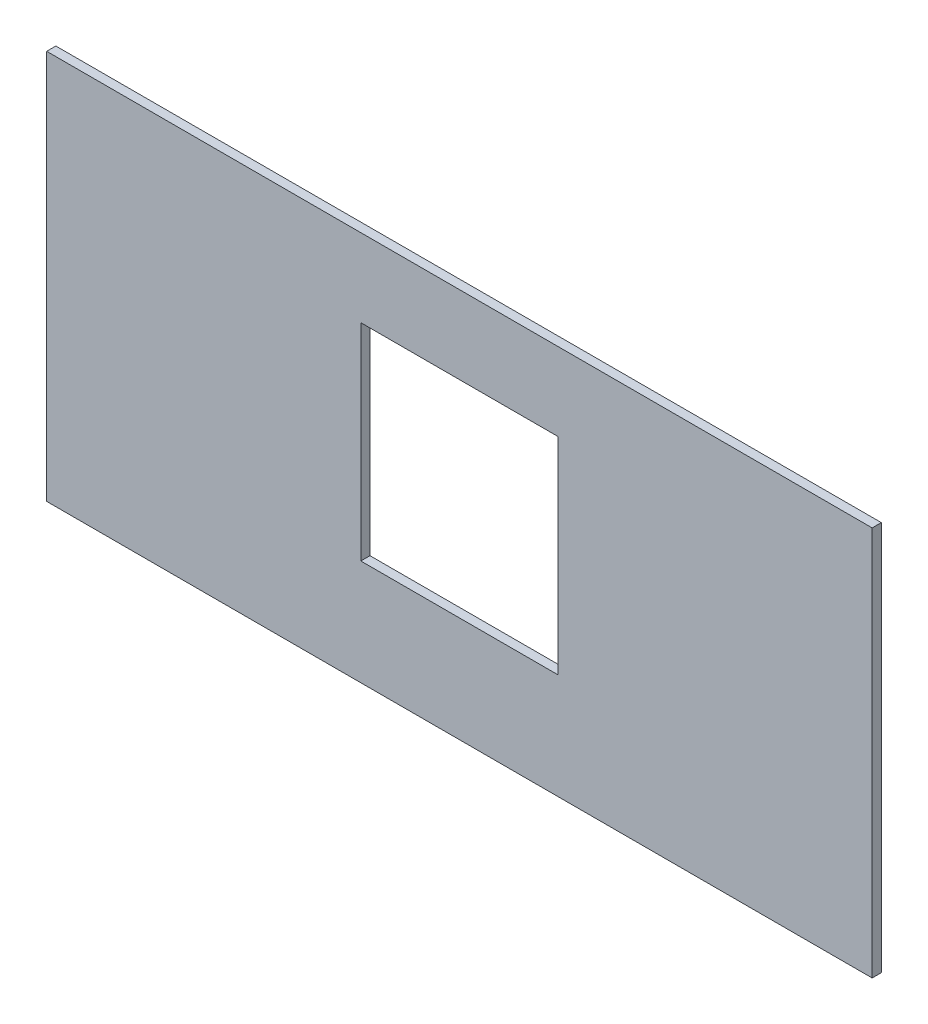
ISO-10303-21;
HEADER;
FILE_DESCRIPTION(('STEP AP214'),'2;1');
FILE_NAME('part.step','',(''),(''),'','','');
FILE_SCHEMA(('AUTOMOTIVE_DESIGN { 1 0 10303 214 1 1 1 1 }'));
ENDSEC;
DATA;
#1=APPLICATION_CONTEXT('core data for automotive mechanical design processes');
#2=APPLICATION_PROTOCOL_DEFINITION('international standard','automotive_design',2000,#1);
#3=PRODUCT_CONTEXT('',#1,'mechanical');
#4=PRODUCT('Part','Part','',(#3));
#5=PRODUCT_RELATED_PRODUCT_CATEGORY('part','',(#4));
#6=PRODUCT_DEFINITION_FORMATION('','',#4);
#7=PRODUCT_DEFINITION_CONTEXT('part definition',#1,'design');
#8=PRODUCT_DEFINITION('design','',#6,#7);
#9=PRODUCT_DEFINITION_SHAPE('','',#8);
#10=(LENGTH_UNIT() NAMED_UNIT(*) SI_UNIT(.MILLI.,.METRE.));
#11=(NAMED_UNIT(*) PLANE_ANGLE_UNIT() SI_UNIT($,.RADIAN.));
#12=(NAMED_UNIT(*) SI_UNIT($,.STERADIAN.) SOLID_ANGLE_UNIT());
#13=UNCERTAINTY_MEASURE_WITH_UNIT(LENGTH_MEASURE(1.E-05),#10,'distance_accuracy_value','');
#14=(GEOMETRIC_REPRESENTATION_CONTEXT(3) GLOBAL_UNCERTAINTY_ASSIGNED_CONTEXT((#13)) GLOBAL_UNIT_ASSIGNED_CONTEXT((#10,
#11,#12)) REPRESENTATION_CONTEXT('',''));
#15=CARTESIAN_POINT('',(0.,0.,0.));
#16=DIRECTION('',(0.,0.,1.));
#17=DIRECTION('',(1.,0.,0.));
#18=AXIS2_PLACEMENT_3D('',#15,#16,#17);
#19=CARTESIAN_POINT('',(0.,0.,2.));
#20=DIRECTION('',(1.,0.,0.));
#21=DIRECTION('',(0.,1.,0.));
#22=AXIS2_PLACEMENT_3D('',#19,#20,#21);
#23=PLANE('',#22);
#24=DIRECTION('',(0.,-1.,0.));
#25=VECTOR('',#24,1.);
#26=CARTESIAN_POINT('',(0.,0.,0.));
#27=LINE('',#26,#25);
#28=CARTESIAN_POINT('',(0.,0.,0.));
#29=VERTEX_POINT('',#28);
#30=CARTESIAN_POINT('',(0.,-85.,0.));
#31=VERTEX_POINT('',#30);
#32=EDGE_CURVE('E135',#29,#31,#27,.T.);
#33=ORIENTED_EDGE('',*,*,#32,.T.);
#34=DIRECTION('',(0.,0.,-1.));
#35=VECTOR('',#34,1.);
#36=CARTESIAN_POINT('',(0.,-85.,2.));
#37=LINE('',#36,#35);
#38=CARTESIAN_POINT('',(0.,-85.,2.));
#39=VERTEX_POINT('',#38);
#40=EDGE_CURVE('E177',#39,#31,#37,.T.);
#41=ORIENTED_EDGE('',*,*,#40,.F.);
#42=DIRECTION('',(0.,-1.,0.));
#43=VECTOR('',#42,1.);
#44=CARTESIAN_POINT('',(0.,0.,2.));
#45=LINE('',#44,#43);
#46=CARTESIAN_POINT('',(0.,0.,2.));
#47=VERTEX_POINT('',#46);
#48=EDGE_CURVE('E140',#47,#39,#45,.T.);
#49=ORIENTED_EDGE('',*,*,#48,.F.);
#50=DIRECTION('',(0.,0.,-1.));
#51=VECTOR('',#50,1.);
#52=CARTESIAN_POINT('',(0.,0.,2.));
#53=LINE('',#52,#51);
#54=EDGE_CURVE('E154',#47,#29,#53,.T.);
#55=ORIENTED_EDGE('',*,*,#54,.T.);
#56=EDGE_LOOP('',(#33,#41,#49,#55));
#57=FACE_BOUND('',#56,.T.);
#58=ADVANCED_FACE('F39',(#57),#23,.F.);
#59=CARTESIAN_POINT('',(0.,-85.,2.));
#60=DIRECTION('',(0.,1.,0.));
#61=DIRECTION('',(0.,0.,1.));
#62=AXIS2_PLACEMENT_3D('',#59,#60,#61);
#63=PLANE('',#62);
#64=DIRECTION('',(1.,0.,0.));
#65=VECTOR('',#64,1.);
#66=CARTESIAN_POINT('',(0.,-85.,0.));
#67=LINE('',#66,#65);
#68=CARTESIAN_POINT('',(180.,-85.,0.));
#69=VERTEX_POINT('',#68);
#70=EDGE_CURVE('E158',#31,#69,#67,.T.);
#71=ORIENTED_EDGE('',*,*,#70,.T.);
#72=DIRECTION('',(0.,0.,-1.));
#73=VECTOR('',#72,1.);
#74=CARTESIAN_POINT('',(180.,-85.,2.));
#75=LINE('',#74,#73);
#76=CARTESIAN_POINT('',(180.,-85.,2.));
#77=VERTEX_POINT('',#76);
#78=EDGE_CURVE('E173',#77,#69,#75,.T.);
#79=ORIENTED_EDGE('',*,*,#78,.F.);
#80=DIRECTION('',(1.,0.,0.));
#81=VECTOR('',#80,1.);
#82=CARTESIAN_POINT('',(0.,-85.,2.));
#83=LINE('',#82,#81);
#84=EDGE_CURVE('E144',#39,#77,#83,.T.);
#85=ORIENTED_EDGE('',*,*,#84,.F.);
#86=ORIENTED_EDGE('',*,*,#40,.T.);
#87=EDGE_LOOP('',(#71,#79,#85,#86));
#88=FACE_BOUND('',#87,.T.);
#89=ADVANCED_FACE('F205',(#88),#63,.F.);
#90=CARTESIAN_POINT('',(180.,0.,2.));
#91=DIRECTION('',(-1.,0.,0.));
#92=DIRECTION('',(0.,0.,1.));
#93=AXIS2_PLACEMENT_3D('',#90,#91,#92);
#94=PLANE('',#93);
#95=DIRECTION('',(0.,1.,0.));
#96=VECTOR('',#95,1.);
#97=CARTESIAN_POINT('',(180.,0.,0.));
#98=LINE('',#97,#96);
#99=CARTESIAN_POINT('',(180.,0.,0.));
#100=VERTEX_POINT('',#99);
#101=EDGE_CURVE('E161',#69,#100,#98,.T.);
#102=ORIENTED_EDGE('',*,*,#101,.T.);
#103=DIRECTION('',(0.,0.,-1.));
#104=VECTOR('',#103,1.);
#105=CARTESIAN_POINT('',(180.,0.,2.));
#106=LINE('',#105,#104);
#107=CARTESIAN_POINT('',(180.,0.,2.));
#108=VERTEX_POINT('',#107);
#109=EDGE_CURVE('E169',#108,#100,#106,.T.);
#110=ORIENTED_EDGE('',*,*,#109,.F.);
#111=DIRECTION('',(0.,1.,0.));
#112=VECTOR('',#111,1.);
#113=CARTESIAN_POINT('',(180.,0.,2.));
#114=LINE('',#113,#112);
#115=EDGE_CURVE('E148',#77,#108,#114,.T.);
#116=ORIENTED_EDGE('',*,*,#115,.F.);
#117=ORIENTED_EDGE('',*,*,#78,.T.);
#118=EDGE_LOOP('',(#102,#110,#116,#117));
#119=FACE_BOUND('',#118,.T.);
#120=ADVANCED_FACE('F210',(#119),#94,.F.);
#121=CARTESIAN_POINT('',(0.,0.,2.));
#122=DIRECTION('',(0.,-1.,0.));
#123=DIRECTION('',(0.,0.,-1.));
#124=AXIS2_PLACEMENT_3D('',#121,#122,#123);
#125=PLANE('',#124);
#126=DIRECTION('',(-1.,0.,0.));
#127=VECTOR('',#126,1.);
#128=CARTESIAN_POINT('',(0.,0.,0.));
#129=LINE('',#128,#127);
#130=EDGE_CURVE('E145',#100,#29,#129,.T.);
#131=ORIENTED_EDGE('',*,*,#130,.T.);
#132=ORIENTED_EDGE('',*,*,#54,.F.);
#133=DIRECTION('',(-1.,0.,0.));
#134=VECTOR('',#133,1.);
#135=CARTESIAN_POINT('',(0.,0.,2.));
#136=LINE('',#135,#134);
#137=EDGE_CURVE('E151',#108,#47,#136,.T.);
#138=ORIENTED_EDGE('',*,*,#137,.F.);
#139=ORIENTED_EDGE('',*,*,#109,.T.);
#140=EDGE_LOOP('',(#131,#132,#138,#139));
#141=FACE_BOUND('',#140,.T.);
#142=ADVANCED_FACE('F223',(#141),#125,.F.);
#143=CARTESIAN_POINT('',(0.,0.,2.));
#144=DIRECTION('',(0.,0.,1.));
#145=DIRECTION('',(1.,0.,0.));
#146=AXIS2_PLACEMENT_3D('',#143,#144,#145);
#147=PLANE('',#146);
#148=DIRECTION('',(0.,-1.,0.));
#149=VECTOR('',#148,1.);
#150=CARTESIAN_POINT('',(68.5,-17.,2.));
#151=LINE('',#150,#149);
#152=CARTESIAN_POINT('',(68.5,-17.,2.));
#153=VERTEX_POINT('',#152);
#154=CARTESIAN_POINT('',(68.5,-62.,2.));
#155=VERTEX_POINT('',#154);
#156=EDGE_CURVE('E54',#153,#155,#151,.T.);
#157=ORIENTED_EDGE('',*,*,#156,.F.);
#158=DIRECTION('',(-1.,0.,0.));
#159=VECTOR('',#158,1.);
#160=CARTESIAN_POINT('',(68.5,-17.,2.));
#161=LINE('',#160,#159);
#162=CARTESIAN_POINT('',(111.5,-17.,2.));
#163=VERTEX_POINT('',#162);
#164=EDGE_CURVE('E125',#163,#153,#161,.T.);
#165=ORIENTED_EDGE('',*,*,#164,.F.);
#166=DIRECTION('',(0.,1.,0.));
#167=VECTOR('',#166,1.);
#168=CARTESIAN_POINT('',(111.5,-17.,2.));
#169=LINE('',#168,#167);
#170=CARTESIAN_POINT('',(111.5,-62.,2.));
#171=VERTEX_POINT('',#170);
#172=EDGE_CURVE('E107',#171,#163,#169,.T.);
#173=ORIENTED_EDGE('',*,*,#172,.F.);
#174=DIRECTION('',(1.,0.,0.));
#175=VECTOR('',#174,1.);
#176=CARTESIAN_POINT('',(68.5,-62.,2.));
#177=LINE('',#176,#175);
#178=EDGE_CURVE('E117',#155,#171,#177,.T.);
#179=ORIENTED_EDGE('',*,*,#178,.F.);
#180=EDGE_LOOP('',(#157,#165,#173,#179));
#181=FACE_BOUND('',#180,.T.);
#182=ORIENTED_EDGE('',*,*,#48,.T.);
#183=ORIENTED_EDGE('',*,*,#84,.T.);
#184=ORIENTED_EDGE('',*,*,#115,.T.);
#185=ORIENTED_EDGE('',*,*,#137,.T.);
#186=EDGE_LOOP('',(#182,#183,#184,#185));
#187=FACE_BOUND('',#186,.T.);
#188=ADVANCED_FACE('F122',(#181,#187),#147,.T.);
#189=CARTESIAN_POINT('',(0.,0.,0.));
#190=DIRECTION('',(0.,0.,1.));
#191=DIRECTION('',(1.,0.,0.));
#192=AXIS2_PLACEMENT_3D('',#189,#190,#191);
#193=PLANE('',#192);
#194=DIRECTION('',(-1.,0.,0.));
#195=VECTOR('',#194,1.);
#196=CARTESIAN_POINT('',(0.,-17.,0.));
#197=LINE('',#196,#195);
#198=CARTESIAN_POINT('',(111.5,-17.,0.));
#199=VERTEX_POINT('',#198);
#200=CARTESIAN_POINT('',(68.5,-17.,0.));
#201=VERTEX_POINT('',#200);
#202=EDGE_CURVE('E47',#199,#201,#197,.T.);
#203=ORIENTED_EDGE('',*,*,#202,.T.);
#204=DIRECTION('',(0.,-1.,0.));
#205=VECTOR('',#204,1.);
#206=CARTESIAN_POINT('',(68.5,0.,0.));
#207=LINE('',#206,#205);
#208=CARTESIAN_POINT('',(68.5,-62.,0.));
#209=VERTEX_POINT('',#208);
#210=EDGE_CURVE('E11',#201,#209,#207,.T.);
#211=ORIENTED_EDGE('',*,*,#210,.T.);
#212=DIRECTION('',(1.,0.,0.));
#213=VECTOR('',#212,1.);
#214=CARTESIAN_POINT('',(0.,-62.,0.));
#215=LINE('',#214,#213);
#216=CARTESIAN_POINT('',(111.5,-62.,0.));
#217=VERTEX_POINT('',#216);
#218=EDGE_CURVE('E181',#209,#217,#215,.T.);
#219=ORIENTED_EDGE('',*,*,#218,.T.);
#220=DIRECTION('',(0.,1.,0.));
#221=VECTOR('',#220,1.);
#222=CARTESIAN_POINT('',(111.5,0.,0.));
#223=LINE('',#222,#221);
#224=EDGE_CURVE('E110',#217,#199,#223,.T.);
#225=ORIENTED_EDGE('',*,*,#224,.T.);
#226=EDGE_LOOP('',(#203,#211,#219,#225));
#227=FACE_BOUND('',#226,.T.);
#228=ORIENTED_EDGE('',*,*,#32,.F.);
#229=ORIENTED_EDGE('',*,*,#130,.F.);
#230=ORIENTED_EDGE('',*,*,#101,.F.);
#231=ORIENTED_EDGE('',*,*,#70,.F.);
#232=EDGE_LOOP('',(#228,#229,#230,#231));
#233=FACE_BOUND('',#232,.T.);
#234=ADVANCED_FACE('F188',(#227,#233),#193,.F.);
#235=CARTESIAN_POINT('',(68.5,-17.,-48.8));
#236=DIRECTION('',(-1.,0.,0.));
#237=DIRECTION('',(0.,-1.,0.));
#238=AXIS2_PLACEMENT_3D('',#235,#236,#237);
#239=PLANE('',#238);
#240=DIRECTION('',(0.,0.,1.));
#241=VECTOR('',#240,1.);
#242=CARTESIAN_POINT('',(68.5,-17.,-48.8));
#243=LINE('',#242,#241);
#244=EDGE_CURVE('E132',#201,#153,#243,.T.);
#245=ORIENTED_EDGE('',*,*,#244,.T.);
#246=ORIENTED_EDGE('',*,*,#156,.T.);
#247=DIRECTION('',(0.,0.,1.));
#248=VECTOR('',#247,1.);
#249=CARTESIAN_POINT('',(68.5,-62.,-48.8));
#250=LINE('',#249,#248);
#251=EDGE_CURVE('E114',#209,#155,#250,.T.);
#252=ORIENTED_EDGE('',*,*,#251,.F.);
#253=ORIENTED_EDGE('',*,*,#210,.F.);
#254=EDGE_LOOP('',(#245,#246,#252,#253));
#255=FACE_BOUND('',#254,.T.);
#256=ADVANCED_FACE('F193',(#255),#239,.F.);
#257=CARTESIAN_POINT('',(68.5,-17.,-48.8));
#258=DIRECTION('',(0.,1.,0.));
#259=DIRECTION('',(0.,0.,1.));
#260=AXIS2_PLACEMENT_3D('',#257,#258,#259);
#261=PLANE('',#260);
#262=DIRECTION('',(0.,0.,1.));
#263=VECTOR('',#262,1.);
#264=CARTESIAN_POINT('',(111.5,-17.,-48.8));
#265=LINE('',#264,#263);
#266=EDGE_CURVE('E113',#199,#163,#265,.T.);
#267=ORIENTED_EDGE('',*,*,#266,.T.);
#268=ORIENTED_EDGE('',*,*,#164,.T.);
#269=ORIENTED_EDGE('',*,*,#244,.F.);
#270=ORIENTED_EDGE('',*,*,#202,.F.);
#271=EDGE_LOOP('',(#267,#268,#269,#270));
#272=FACE_BOUND('',#271,.T.);
#273=ADVANCED_FACE('F192',(#272),#261,.F.);
#274=CARTESIAN_POINT('',(111.5,-17.,-48.8));
#275=DIRECTION('',(1.,0.,0.));
#276=DIRECTION('',(0.,1.,0.));
#277=AXIS2_PLACEMENT_3D('',#274,#275,#276);
#278=PLANE('',#277);
#279=DIRECTION('',(0.,0.,1.));
#280=VECTOR('',#279,1.);
#281=CARTESIAN_POINT('',(111.5,-62.,-48.8));
#282=LINE('',#281,#280);
#283=EDGE_CURVE('E62',#217,#171,#282,.T.);
#284=ORIENTED_EDGE('',*,*,#283,.T.);
#285=ORIENTED_EDGE('',*,*,#172,.T.);
#286=ORIENTED_EDGE('',*,*,#266,.F.);
#287=ORIENTED_EDGE('',*,*,#224,.F.);
#288=EDGE_LOOP('',(#284,#285,#286,#287));
#289=FACE_BOUND('',#288,.T.);
#290=ADVANCED_FACE('F104',(#289),#278,.F.);
#291=CARTESIAN_POINT('',(68.5,-62.,-48.8));
#292=DIRECTION('',(0.,-1.,0.));
#293=DIRECTION('',(0.,0.,-1.));
#294=AXIS2_PLACEMENT_3D('',#291,#292,#293);
#295=PLANE('',#294);
#296=ORIENTED_EDGE('',*,*,#251,.T.);
#297=ORIENTED_EDGE('',*,*,#178,.T.);
#298=ORIENTED_EDGE('',*,*,#283,.F.);
#299=ORIENTED_EDGE('',*,*,#218,.F.);
#300=EDGE_LOOP('',(#296,#297,#298,#299));
#301=FACE_BOUND('',#300,.T.);
#302=ADVANCED_FACE('F118',(#301),#295,.F.);
#303=CLOSED_SHELL('',(#58,#89,#120,#142,#188,#234,#256,#273,#290,#302));
#304=MANIFOLD_SOLID_BREP('B2',#303);
#305=ADVANCED_BREP_SHAPE_REPRESENTATION('',(#18,#304),#14);
#306=SHAPE_DEFINITION_REPRESENTATION(#9,#305);
ENDSEC;
END-ISO-10303-21;
